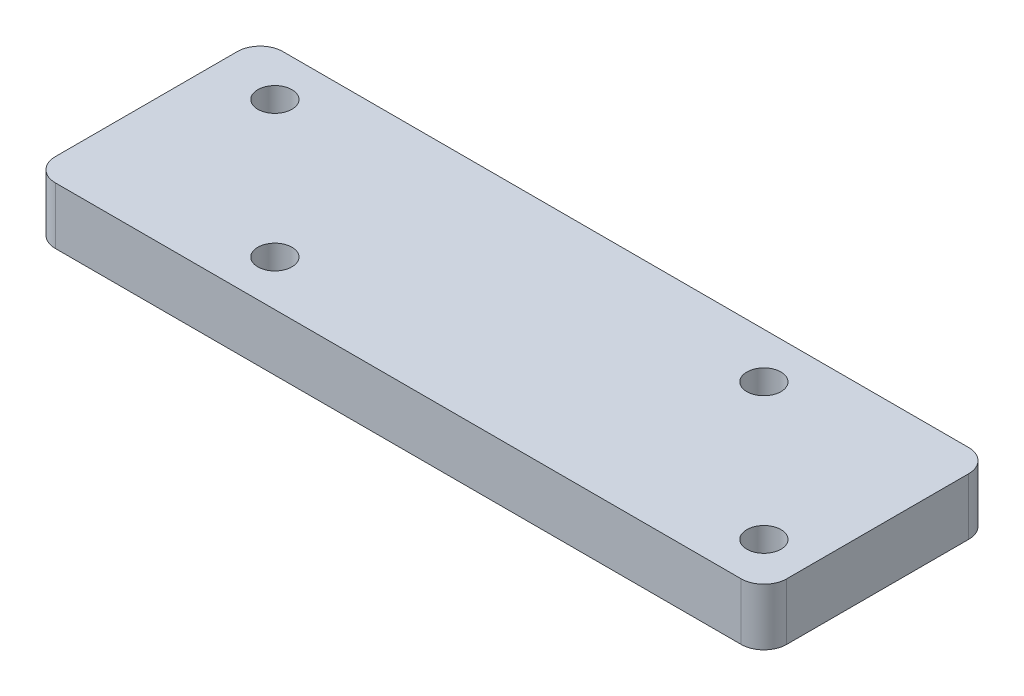
ISO-10303-21;
HEADER;
FILE_DESCRIPTION(('STEP AP214'),'2;1');
FILE_NAME('part.step','',(''),(''),'','','');
FILE_SCHEMA(('AUTOMOTIVE_DESIGN { 1 0 10303 214 1 1 1 1 }'));
ENDSEC;
DATA;
#1=APPLICATION_CONTEXT('core data for automotive mechanical design processes');
#2=APPLICATION_PROTOCOL_DEFINITION('international standard','automotive_design',2000,#1);
#3=PRODUCT_CONTEXT('',#1,'mechanical');
#4=PRODUCT('Part','Part','',(#3));
#5=PRODUCT_RELATED_PRODUCT_CATEGORY('part','',(#4));
#6=PRODUCT_DEFINITION_FORMATION('','',#4);
#7=PRODUCT_DEFINITION_CONTEXT('part definition',#1,'design');
#8=PRODUCT_DEFINITION('design','',#6,#7);
#9=PRODUCT_DEFINITION_SHAPE('','',#8);
#10=(LENGTH_UNIT() NAMED_UNIT(*) SI_UNIT(.MILLI.,.METRE.));
#11=(NAMED_UNIT(*) PLANE_ANGLE_UNIT() SI_UNIT($,.RADIAN.));
#12=(NAMED_UNIT(*) SI_UNIT($,.STERADIAN.) SOLID_ANGLE_UNIT());
#13=UNCERTAINTY_MEASURE_WITH_UNIT(LENGTH_MEASURE(1.E-05),#10,'distance_accuracy_value','');
#14=(GEOMETRIC_REPRESENTATION_CONTEXT(3) GLOBAL_UNCERTAINTY_ASSIGNED_CONTEXT((#13)) GLOBAL_UNIT_ASSIGNED_CONTEXT((#10,
#11,#12)) REPRESENTATION_CONTEXT('',''));
#15=CARTESIAN_POINT('',(0.,0.,0.));
#16=DIRECTION('',(0.,0.,1.));
#17=DIRECTION('',(1.,0.,0.));
#18=AXIS2_PLACEMENT_3D('',#15,#16,#17);
#19=CARTESIAN_POINT('',(0.,5.,0.));
#20=DIRECTION('',(0.,-1.,0.));
#21=DIRECTION('',(0.,0.,-1.));
#22=AXIS2_PLACEMENT_3D('',#19,#20,#21);
#23=PLANE('',#22);
#24=DIRECTION('',(-1.,0.,0.));
#25=VECTOR('',#24,1.);
#26=CARTESIAN_POINT('',(0.,5.,-20.));
#27=LINE('',#26,#25);
#28=CARTESIAN_POINT('',(62.3,5.,-20.));
#29=VERTEX_POINT('',#28);
#30=CARTESIAN_POINT('',(2.,5.,-20.));
#31=VERTEX_POINT('',#30);
#32=EDGE_CURVE('E152',#29,#31,#27,.T.);
#33=ORIENTED_EDGE('',*,*,#32,.T.);
#34=CARTESIAN_POINT('',(2.,5.,-18.));
#35=DIRECTION('',(0.,-1.,0.));
#36=DIRECTION('',(0.,0.,-1.));
#37=AXIS2_PLACEMENT_3D('',#34,#35,#36);
#38=CIRCLE('',#37,2.);
#39=CARTESIAN_POINT('',(0.,5.,-18.));
#40=VERTEX_POINT('',#39);
#41=EDGE_CURVE('E184',#31,#40,#38,.F.);
#42=ORIENTED_EDGE('',*,*,#41,.T.);
#43=DIRECTION('',(0.,0.,1.));
#44=VECTOR('',#43,1.);
#45=CARTESIAN_POINT('',(0.,5.,0.));
#46=LINE('',#45,#44);
#47=CARTESIAN_POINT('',(0.,5.,-2.));
#48=VERTEX_POINT('',#47);
#49=EDGE_CURVE('E131',#40,#48,#46,.T.);
#50=ORIENTED_EDGE('',*,*,#49,.T.);
#51=CARTESIAN_POINT('',(2.,5.,-2.));
#52=DIRECTION('',(0.,-1.,0.));
#53=DIRECTION('',(0.,0.,-1.));
#54=AXIS2_PLACEMENT_3D('',#51,#52,#53);
#55=CIRCLE('',#54,2.);
#56=CARTESIAN_POINT('',(2.,5.,0.));
#57=VERTEX_POINT('',#56);
#58=EDGE_CURVE('E176',#48,#57,#55,.F.);
#59=ORIENTED_EDGE('',*,*,#58,.T.);
#60=DIRECTION('',(1.,0.,0.));
#61=VECTOR('',#60,1.);
#62=CARTESIAN_POINT('',(0.,5.,0.));
#63=LINE('',#62,#61);
#64=CARTESIAN_POINT('',(62.3,5.,0.));
#65=VERTEX_POINT('',#64);
#66=EDGE_CURVE('E200',#57,#65,#63,.T.);
#67=ORIENTED_EDGE('',*,*,#66,.T.);
#68=CARTESIAN_POINT('',(62.3,5.,-2.));
#69=DIRECTION('',(0.,-1.,0.));
#70=DIRECTION('',(0.,0.,-1.));
#71=AXIS2_PLACEMENT_3D('',#68,#69,#70);
#72=CIRCLE('',#71,2.);
#73=CARTESIAN_POINT('',(64.3,5.,-2.));
#74=VERTEX_POINT('',#73);
#75=EDGE_CURVE('E68',#65,#74,#72,.F.);
#76=ORIENTED_EDGE('',*,*,#75,.T.);
#77=DIRECTION('',(0.,0.,-1.));
#78=VECTOR('',#77,1.);
#79=CARTESIAN_POINT('',(64.3,5.,0.));
#80=LINE('',#79,#78);
#81=CARTESIAN_POINT('',(64.3,5.,-18.));
#82=VERTEX_POINT('',#81);
#83=EDGE_CURVE('E210',#74,#82,#80,.T.);
#84=ORIENTED_EDGE('',*,*,#83,.T.);
#85=CARTESIAN_POINT('',(62.3,5.,-18.));
#86=DIRECTION('',(0.,-1.,0.));
#87=DIRECTION('',(0.,0.,-1.));
#88=AXIS2_PLACEMENT_3D('',#85,#86,#87);
#89=CIRCLE('',#88,2.);
#90=EDGE_CURVE('E182',#82,#29,#89,.F.);
#91=ORIENTED_EDGE('',*,*,#90,.T.);
#92=EDGE_LOOP('',(#33,#42,#50,#59,#67,#76,#84,#91));
#93=FACE_BOUND('',#92,.T.);
#94=CARTESIAN_POINT('',(5.3,5.,-16.));
#95=DIRECTION('',(0.,1.,0.));
#96=DIRECTION('',(0.,0.,1.));
#97=AXIS2_PLACEMENT_3D('',#94,#95,#96);
#98=CIRCLE('',#97,1.5);
#99=CARTESIAN_POINT('',(5.3,5.,-14.5));
#100=VERTEX_POINT('',#99);
#101=EDGE_CURVE('E141',#100,#100,#98,.T.);
#102=ORIENTED_EDGE('',*,*,#101,.F.);
#103=EDGE_LOOP('',(#102));
#104=FACE_BOUND('',#103,.T.);
#105=CARTESIAN_POINT('',(17.3,5.,-4.));
#106=DIRECTION('',(0.,1.,0.));
#107=DIRECTION('',(0.,0.,1.));
#108=AXIS2_PLACEMENT_3D('',#105,#106,#107);
#109=CIRCLE('',#108,1.5);
#110=CARTESIAN_POINT('',(17.3,5.,-2.5));
#111=VERTEX_POINT('',#110);
#112=EDGE_CURVE('E218',#111,#111,#109,.T.);
#113=ORIENTED_EDGE('',*,*,#112,.F.);
#114=EDGE_LOOP('',(#113));
#115=FACE_BOUND('',#114,.T.);
#116=CARTESIAN_POINT('',(48.3,5.,-16.));
#117=DIRECTION('',(0.,1.,0.));
#118=DIRECTION('',(0.,0.,1.));
#119=AXIS2_PLACEMENT_3D('',#116,#117,#118);
#120=CIRCLE('',#119,1.5);
#121=CARTESIAN_POINT('',(48.3,5.,-14.5));
#122=VERTEX_POINT('',#121);
#123=EDGE_CURVE('E223',#122,#122,#120,.T.);
#124=ORIENTED_EDGE('',*,*,#123,.F.);
#125=EDGE_LOOP('',(#124));
#126=FACE_BOUND('',#125,.T.);
#127=CARTESIAN_POINT('',(60.3,5.,-4.));
#128=DIRECTION('',(0.,1.,0.));
#129=DIRECTION('',(0.,0.,1.));
#130=AXIS2_PLACEMENT_3D('',#127,#128,#129);
#131=CIRCLE('',#130,1.5);
#132=CARTESIAN_POINT('',(60.3,5.,-2.5));
#133=VERTEX_POINT('',#132);
#134=EDGE_CURVE('E233',#133,#133,#131,.T.);
#135=ORIENTED_EDGE('',*,*,#134,.F.);
#136=EDGE_LOOP('',(#135));
#137=FACE_BOUND('',#136,.T.);
#138=ADVANCED_FACE('F44',(#93,#104,#115,#126,#137),#23,.F.);
#139=CARTESIAN_POINT('',(0.,0.,0.));
#140=DIRECTION('',(0.,-1.,0.));
#141=DIRECTION('',(0.,0.,-1.));
#142=AXIS2_PLACEMENT_3D('',#139,#140,#141);
#143=PLANE('',#142);
#144=CARTESIAN_POINT('',(48.3,0.,-16.));
#145=DIRECTION('',(0.,1.,0.));
#146=DIRECTION('',(0.,0.,1.));
#147=AXIS2_PLACEMENT_3D('',#144,#145,#146);
#148=CIRCLE('',#147,1.5);
#149=CARTESIAN_POINT('',(48.3,0.,-14.5));
#150=VERTEX_POINT('',#149);
#151=EDGE_CURVE('E227',#150,#150,#148,.T.);
#152=ORIENTED_EDGE('',*,*,#151,.T.);
#153=EDGE_LOOP('',(#152));
#154=FACE_BOUND('',#153,.T.);
#155=CARTESIAN_POINT('',(5.3,0.,-16.));
#156=DIRECTION('',(0.,1.,0.));
#157=DIRECTION('',(0.,0.,1.));
#158=AXIS2_PLACEMENT_3D('',#155,#156,#157);
#159=CIRCLE('',#158,1.5);
#160=CARTESIAN_POINT('',(5.3,0.,-14.5));
#161=VERTEX_POINT('',#160);
#162=EDGE_CURVE('E151',#161,#161,#159,.T.);
#163=ORIENTED_EDGE('',*,*,#162,.T.);
#164=EDGE_LOOP('',(#163));
#165=FACE_BOUND('',#164,.T.);
#166=DIRECTION('',(0.,0.,1.));
#167=VECTOR('',#166,1.);
#168=CARTESIAN_POINT('',(0.,0.,0.));
#169=LINE('',#168,#167);
#170=CARTESIAN_POINT('',(0.,0.,-18.));
#171=VERTEX_POINT('',#170);
#172=CARTESIAN_POINT('',(0.,0.,-2.));
#173=VERTEX_POINT('',#172);
#174=EDGE_CURVE('E128',#171,#173,#169,.T.);
#175=ORIENTED_EDGE('',*,*,#174,.F.);
#176=CARTESIAN_POINT('',(2.,0.,-18.));
#177=DIRECTION('',(0.,-1.,0.));
#178=DIRECTION('',(0.,0.,-1.));
#179=AXIS2_PLACEMENT_3D('',#176,#177,#178);
#180=CIRCLE('',#179,2.);
#181=CARTESIAN_POINT('',(2.,0.,-20.));
#182=VERTEX_POINT('',#181);
#183=EDGE_CURVE('E115',#171,#182,#180,.T.);
#184=ORIENTED_EDGE('',*,*,#183,.T.);
#185=DIRECTION('',(-1.,0.,0.));
#186=VECTOR('',#185,1.);
#187=CARTESIAN_POINT('',(0.,0.,-20.));
#188=LINE('',#187,#186);
#189=CARTESIAN_POINT('',(62.3,0.,-20.));
#190=VERTEX_POINT('',#189);
#191=EDGE_CURVE('E157',#190,#182,#188,.T.);
#192=ORIENTED_EDGE('',*,*,#191,.F.);
#193=CARTESIAN_POINT('',(62.3,0.,-18.));
#194=DIRECTION('',(0.,-1.,0.));
#195=DIRECTION('',(0.,0.,-1.));
#196=AXIS2_PLACEMENT_3D('',#193,#194,#195);
#197=CIRCLE('',#196,2.);
#198=CARTESIAN_POINT('',(64.3,0.,-18.));
#199=VERTEX_POINT('',#198);
#200=EDGE_CURVE('E122',#190,#199,#197,.T.);
#201=ORIENTED_EDGE('',*,*,#200,.T.);
#202=DIRECTION('',(0.,0.,-1.));
#203=VECTOR('',#202,1.);
#204=CARTESIAN_POINT('',(64.3,0.,0.));
#205=LINE('',#204,#203);
#206=CARTESIAN_POINT('',(64.3,0.,-2.));
#207=VERTEX_POINT('',#206);
#208=EDGE_CURVE('E146',#207,#199,#205,.T.);
#209=ORIENTED_EDGE('',*,*,#208,.F.);
#210=CARTESIAN_POINT('',(62.3,0.,-2.));
#211=DIRECTION('',(0.,-1.,0.));
#212=DIRECTION('',(0.,0.,-1.));
#213=AXIS2_PLACEMENT_3D('',#210,#211,#212);
#214=CIRCLE('',#213,2.);
#215=CARTESIAN_POINT('',(62.3,0.,0.));
#216=VERTEX_POINT('',#215);
#217=EDGE_CURVE('E167',#207,#216,#214,.T.);
#218=ORIENTED_EDGE('',*,*,#217,.T.);
#219=DIRECTION('',(1.,0.,0.));
#220=VECTOR('',#219,1.);
#221=CARTESIAN_POINT('',(0.,0.,0.));
#222=LINE('',#221,#220);
#223=CARTESIAN_POINT('',(2.,0.,0.));
#224=VERTEX_POINT('',#223);
#225=EDGE_CURVE('E142',#224,#216,#222,.T.);
#226=ORIENTED_EDGE('',*,*,#225,.F.);
#227=CARTESIAN_POINT('',(2.,0.,-2.));
#228=DIRECTION('',(0.,-1.,0.));
#229=DIRECTION('',(0.,0.,-1.));
#230=AXIS2_PLACEMENT_3D('',#227,#228,#229);
#231=CIRCLE('',#230,2.);
#232=EDGE_CURVE('E134',#224,#173,#231,.T.);
#233=ORIENTED_EDGE('',*,*,#232,.T.);
#234=EDGE_LOOP('',(#175,#184,#192,#201,#209,#218,#226,#233));
#235=FACE_BOUND('',#234,.T.);
#236=CARTESIAN_POINT('',(17.3,0.,-4.));
#237=DIRECTION('',(0.,1.,0.));
#238=DIRECTION('',(0.,0.,1.));
#239=AXIS2_PLACEMENT_3D('',#236,#237,#238);
#240=CIRCLE('',#239,1.5);
#241=CARTESIAN_POINT('',(17.3,0.,-2.5));
#242=VERTEX_POINT('',#241);
#243=EDGE_CURVE('E222',#242,#242,#240,.T.);
#244=ORIENTED_EDGE('',*,*,#243,.T.);
#245=EDGE_LOOP('',(#244));
#246=FACE_BOUND('',#245,.T.);
#247=CARTESIAN_POINT('',(60.3,0.,-4.));
#248=DIRECTION('',(0.,1.,0.));
#249=DIRECTION('',(0.,0.,1.));
#250=AXIS2_PLACEMENT_3D('',#247,#248,#249);
#251=CIRCLE('',#250,1.5);
#252=CARTESIAN_POINT('',(60.3,0.,-2.5));
#253=VERTEX_POINT('',#252);
#254=EDGE_CURVE('E240',#253,#253,#251,.T.);
#255=ORIENTED_EDGE('',*,*,#254,.T.);
#256=EDGE_LOOP('',(#255));
#257=FACE_BOUND('',#256,.T.);
#258=ADVANCED_FACE('F138',(#154,#165,#235,#246,#257),#143,.T.);
#259=CARTESIAN_POINT('',(0.,5.,0.));
#260=DIRECTION('',(1.,0.,0.));
#261=DIRECTION('',(0.,0.,-1.));
#262=AXIS2_PLACEMENT_3D('',#259,#260,#261);
#263=PLANE('',#262);
#264=ORIENTED_EDGE('',*,*,#49,.F.);
#265=DIRECTION('',(0.,-1.,0.));
#266=VECTOR('',#265,1.);
#267=CARTESIAN_POINT('',(0.,5.,-18.));
#268=LINE('',#267,#266);
#269=EDGE_CURVE('E118',#40,#171,#268,.T.);
#270=ORIENTED_EDGE('',*,*,#269,.T.);
#271=ORIENTED_EDGE('',*,*,#174,.T.);
#272=DIRECTION('',(0.,-1.,0.));
#273=VECTOR('',#272,1.);
#274=CARTESIAN_POINT('',(0.,5.,-2.));
#275=LINE('',#274,#273);
#276=EDGE_CURVE('E136',#173,#48,#275,.F.);
#277=ORIENTED_EDGE('',*,*,#276,.T.);
#278=EDGE_LOOP('',(#264,#270,#271,#277));
#279=FACE_BOUND('',#278,.T.);
#280=ADVANCED_FACE('F129',(#279),#263,.F.);
#281=CARTESIAN_POINT('',(0.,5.,0.));
#282=DIRECTION('',(0.,0.,-1.));
#283=DIRECTION('',(-1.,0.,0.));
#284=AXIS2_PLACEMENT_3D('',#281,#282,#283);
#285=PLANE('',#284);
#286=ORIENTED_EDGE('',*,*,#225,.T.);
#287=DIRECTION('',(0.,-1.,0.));
#288=VECTOR('',#287,1.);
#289=CARTESIAN_POINT('',(62.3,5.,0.));
#290=LINE('',#289,#288);
#291=EDGE_CURVE('E11',#216,#65,#290,.F.);
#292=ORIENTED_EDGE('',*,*,#291,.T.);
#293=ORIENTED_EDGE('',*,*,#66,.F.);
#294=DIRECTION('',(0.,-1.,0.));
#295=VECTOR('',#294,1.);
#296=CARTESIAN_POINT('',(2.,5.,0.));
#297=LINE('',#296,#295);
#298=EDGE_CURVE('E53',#57,#224,#297,.T.);
#299=ORIENTED_EDGE('',*,*,#298,.T.);
#300=EDGE_LOOP('',(#286,#292,#293,#299));
#301=FACE_BOUND('',#300,.T.);
#302=ADVANCED_FACE('F197',(#301),#285,.F.);
#303=CARTESIAN_POINT('',(64.3,5.,0.));
#304=DIRECTION('',(-1.,0.,0.));
#305=DIRECTION('',(0.,0.,1.));
#306=AXIS2_PLACEMENT_3D('',#303,#304,#305);
#307=PLANE('',#306);
#308=ORIENTED_EDGE('',*,*,#208,.T.);
#309=DIRECTION('',(0.,-1.,0.));
#310=VECTOR('',#309,1.);
#311=CARTESIAN_POINT('',(64.3,5.,-18.));
#312=LINE('',#311,#310);
#313=EDGE_CURVE('E63',#199,#82,#312,.F.);
#314=ORIENTED_EDGE('',*,*,#313,.T.);
#315=ORIENTED_EDGE('',*,*,#83,.F.);
#316=DIRECTION('',(0.,-1.,0.));
#317=VECTOR('',#316,1.);
#318=CARTESIAN_POINT('',(64.3,5.,-2.));
#319=LINE('',#318,#317);
#320=EDGE_CURVE('E190',#74,#207,#319,.T.);
#321=ORIENTED_EDGE('',*,*,#320,.T.);
#322=EDGE_LOOP('',(#308,#314,#315,#321));
#323=FACE_BOUND('',#322,.T.);
#324=ADVANCED_FACE('F206',(#323),#307,.F.);
#325=CARTESIAN_POINT('',(0.,5.,-20.));
#326=DIRECTION('',(0.,0.,1.));
#327=DIRECTION('',(1.,0.,0.));
#328=AXIS2_PLACEMENT_3D('',#325,#326,#327);
#329=PLANE('',#328);
#330=ORIENTED_EDGE('',*,*,#191,.T.);
#331=DIRECTION('',(0.,-1.,0.));
#332=VECTOR('',#331,1.);
#333=CARTESIAN_POINT('',(2.,5.,-20.));
#334=LINE('',#333,#332);
#335=EDGE_CURVE('E120',#182,#31,#334,.F.);
#336=ORIENTED_EDGE('',*,*,#335,.T.);
#337=ORIENTED_EDGE('',*,*,#32,.F.);
#338=DIRECTION('',(0.,-1.,0.));
#339=VECTOR('',#338,1.);
#340=CARTESIAN_POINT('',(62.3,5.,-20.));
#341=LINE('',#340,#339);
#342=EDGE_CURVE('E123',#29,#190,#341,.T.);
#343=ORIENTED_EDGE('',*,*,#342,.T.);
#344=EDGE_LOOP('',(#330,#336,#337,#343));
#345=FACE_BOUND('',#344,.T.);
#346=ADVANCED_FACE('F261',(#345),#329,.F.);
#347=CARTESIAN_POINT('',(5.3,5.,-16.));
#348=DIRECTION('',(0.,-1.,0.));
#349=DIRECTION('',(0.,0.,-1.));
#350=AXIS2_PLACEMENT_3D('',#347,#348,#349);
#351=CYLINDRICAL_SURFACE('',#350,1.5);
#352=ORIENTED_EDGE('',*,*,#101,.T.);
#353=EDGE_LOOP('',(#352));
#354=FACE_BOUND('',#353,.T.);
#355=ORIENTED_EDGE('',*,*,#162,.F.);
#356=EDGE_LOOP('',(#355));
#357=FACE_BOUND('',#356,.T.);
#358=ADVANCED_FACE('F256',(#354,#357),#351,.F.);
#359=CARTESIAN_POINT('',(17.3,5.,-4.));
#360=DIRECTION('',(0.,-1.,0.));
#361=DIRECTION('',(0.,0.,-1.));
#362=AXIS2_PLACEMENT_3D('',#359,#360,#361);
#363=CYLINDRICAL_SURFACE('',#362,1.5);
#364=ORIENTED_EDGE('',*,*,#112,.T.);
#365=EDGE_LOOP('',(#364));
#366=FACE_BOUND('',#365,.T.);
#367=ORIENTED_EDGE('',*,*,#243,.F.);
#368=EDGE_LOOP('',(#367));
#369=FACE_BOUND('',#368,.T.);
#370=ADVANCED_FACE('F318',(#366,#369),#363,.F.);
#371=CARTESIAN_POINT('',(48.3,5.,-16.));
#372=DIRECTION('',(0.,-1.,0.));
#373=DIRECTION('',(0.,0.,-1.));
#374=AXIS2_PLACEMENT_3D('',#371,#372,#373);
#375=CYLINDRICAL_SURFACE('',#374,1.5);
#376=ORIENTED_EDGE('',*,*,#123,.T.);
#377=EDGE_LOOP('',(#376));
#378=FACE_BOUND('',#377,.T.);
#379=ORIENTED_EDGE('',*,*,#151,.F.);
#380=EDGE_LOOP('',(#379));
#381=FACE_BOUND('',#380,.T.);
#382=ADVANCED_FACE('F310',(#378,#381),#375,.F.);
#383=CARTESIAN_POINT('',(60.3,5.,-4.));
#384=DIRECTION('',(0.,-1.,0.));
#385=DIRECTION('',(0.,0.,-1.));
#386=AXIS2_PLACEMENT_3D('',#383,#384,#385);
#387=CYLINDRICAL_SURFACE('',#386,1.5);
#388=ORIENTED_EDGE('',*,*,#134,.T.);
#389=EDGE_LOOP('',(#388));
#390=FACE_BOUND('',#389,.T.);
#391=ORIENTED_EDGE('',*,*,#254,.F.);
#392=EDGE_LOOP('',(#391));
#393=FACE_BOUND('',#392,.T.);
#394=ADVANCED_FACE('F244',(#390,#393),#387,.F.);
#395=CARTESIAN_POINT('',(2.,5.,-18.));
#396=DIRECTION('',(0.,-1.,0.));
#397=DIRECTION('',(0.,0.,-1.));
#398=AXIS2_PLACEMENT_3D('',#395,#396,#397);
#399=CYLINDRICAL_SURFACE('',#398,2.);
#400=ORIENTED_EDGE('',*,*,#41,.F.);
#401=ORIENTED_EDGE('',*,*,#335,.F.);
#402=ORIENTED_EDGE('',*,*,#183,.F.);
#403=ORIENTED_EDGE('',*,*,#269,.F.);
#404=EDGE_LOOP('',(#400,#401,#402,#403));
#405=FACE_BOUND('',#404,.T.);
#406=ADVANCED_FACE('F113',(#405),#399,.T.);
#407=CARTESIAN_POINT('',(62.3,5.,-18.));
#408=DIRECTION('',(0.,-1.,0.));
#409=DIRECTION('',(0.,0.,-1.));
#410=AXIS2_PLACEMENT_3D('',#407,#408,#409);
#411=CYLINDRICAL_SURFACE('',#410,2.);
#412=ORIENTED_EDGE('',*,*,#90,.F.);
#413=ORIENTED_EDGE('',*,*,#313,.F.);
#414=ORIENTED_EDGE('',*,*,#200,.F.);
#415=ORIENTED_EDGE('',*,*,#342,.F.);
#416=EDGE_LOOP('',(#412,#413,#414,#415));
#417=FACE_BOUND('',#416,.T.);
#418=ADVANCED_FACE('F272',(#417),#411,.T.);
#419=CARTESIAN_POINT('',(62.3,5.,-2.));
#420=DIRECTION('',(0.,-1.,0.));
#421=DIRECTION('',(0.,0.,-1.));
#422=AXIS2_PLACEMENT_3D('',#419,#420,#421);
#423=CYLINDRICAL_SURFACE('',#422,2.);
#424=ORIENTED_EDGE('',*,*,#75,.F.);
#425=ORIENTED_EDGE('',*,*,#291,.F.);
#426=ORIENTED_EDGE('',*,*,#217,.F.);
#427=ORIENTED_EDGE('',*,*,#320,.F.);
#428=EDGE_LOOP('',(#424,#425,#426,#427));
#429=FACE_BOUND('',#428,.T.);
#430=ADVANCED_FACE('F202',(#429),#423,.T.);
#431=CARTESIAN_POINT('',(2.,5.,-2.));
#432=DIRECTION('',(0.,-1.,0.));
#433=DIRECTION('',(0.,0.,-1.));
#434=AXIS2_PLACEMENT_3D('',#431,#432,#433);
#435=CYLINDRICAL_SURFACE('',#434,2.);
#436=ORIENTED_EDGE('',*,*,#58,.F.);
#437=ORIENTED_EDGE('',*,*,#276,.F.);
#438=ORIENTED_EDGE('',*,*,#232,.F.);
#439=ORIENTED_EDGE('',*,*,#298,.F.);
#440=EDGE_LOOP('',(#436,#437,#438,#439));
#441=FACE_BOUND('',#440,.T.);
#442=ADVANCED_FACE('F50',(#441),#435,.T.);
#443=CLOSED_SHELL('',(#138,#258,#280,#302,#324,#346,#358,#370,#382,#394,#406,#418,#430,#442));
#444=MANIFOLD_SOLID_BREP('B2',#443);
#445=ADVANCED_BREP_SHAPE_REPRESENTATION('',(#18,#444),#14);
#446=SHAPE_DEFINITION_REPRESENTATION(#9,#445);
ENDSEC;
END-ISO-10303-21;
